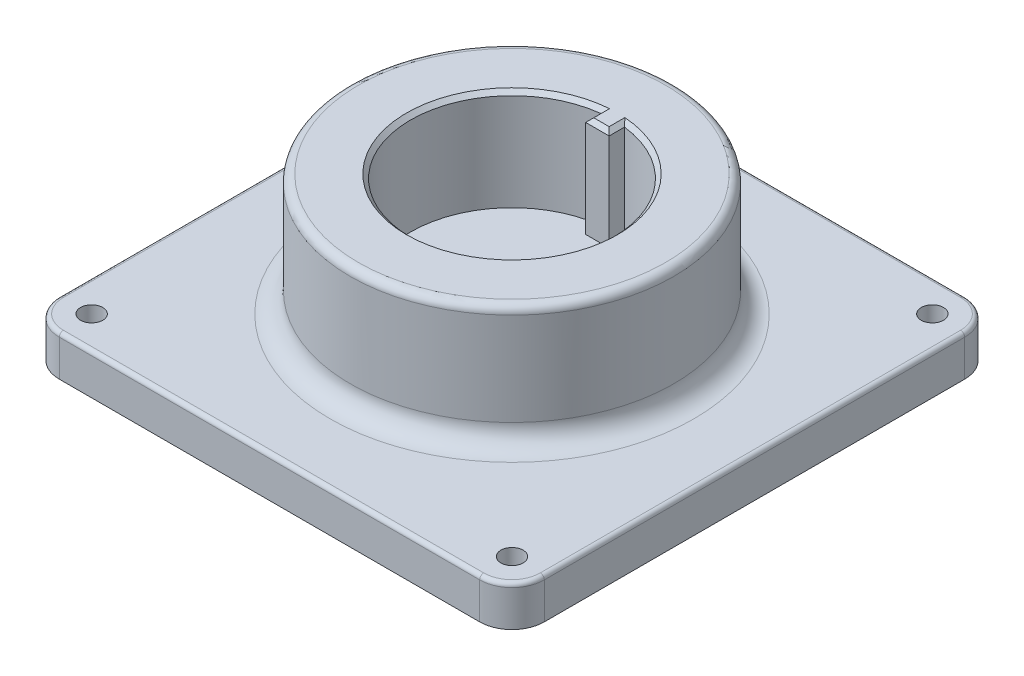
ISO-10303-21;
HEADER;
FILE_DESCRIPTION(('STEP AP214'),'2;1');
FILE_NAME('part.step','',(''),(''),'','','');
FILE_SCHEMA(('AUTOMOTIVE_DESIGN { 1 0 10303 214 1 1 1 1 }'));
ENDSEC;
DATA;
#1=APPLICATION_CONTEXT('core data for automotive mechanical design processes');
#2=APPLICATION_PROTOCOL_DEFINITION('international standard','automotive_design',2000,#1);
#3=PRODUCT_CONTEXT('',#1,'mechanical');
#4=PRODUCT('Part','Part','',(#3));
#5=PRODUCT_RELATED_PRODUCT_CATEGORY('part','',(#4));
#6=PRODUCT_DEFINITION_FORMATION('','',#4);
#7=PRODUCT_DEFINITION_CONTEXT('part definition',#1,'design');
#8=PRODUCT_DEFINITION('design','',#6,#7);
#9=PRODUCT_DEFINITION_SHAPE('','',#8);
#10=(LENGTH_UNIT() NAMED_UNIT(*) SI_UNIT(.MILLI.,.METRE.));
#11=(NAMED_UNIT(*) PLANE_ANGLE_UNIT() SI_UNIT($,.RADIAN.));
#12=(NAMED_UNIT(*) SI_UNIT($,.STERADIAN.) SOLID_ANGLE_UNIT());
#13=UNCERTAINTY_MEASURE_WITH_UNIT(LENGTH_MEASURE(1.E-05),#10,'distance_accuracy_value','');
#14=(GEOMETRIC_REPRESENTATION_CONTEXT(3) GLOBAL_UNCERTAINTY_ASSIGNED_CONTEXT((#13)) GLOBAL_UNIT_ASSIGNED_CONTEXT((#10,
#11,#12)) REPRESENTATION_CONTEXT('',''));
#15=CARTESIAN_POINT('',(0.,0.,0.));
#16=DIRECTION('',(0.,0.,1.));
#17=DIRECTION('',(1.,0.,0.));
#18=AXIS2_PLACEMENT_3D('',#15,#16,#17);
#19=CARTESIAN_POINT('',(60.,10.,60.));
#20=DIRECTION('',(-1.,0.,0.));
#21=DIRECTION('',(0.,0.,1.));
#22=AXIS2_PLACEMENT_3D('',#19,#20,#21);
#23=PLANE('',#22);
#24=DIRECTION('',(0.,-1.,0.));
#25=VECTOR('',#24,1.);
#26=CARTESIAN_POINT('',(60.,10.,-52.));
#27=LINE('',#26,#25);
#28=CARTESIAN_POINT('',(60.,0.,-52.));
#29=VERTEX_POINT('',#28);
#30=CARTESIAN_POINT('',(60.,9.,-52.));
#31=VERTEX_POINT('',#30);
#32=EDGE_CURVE('E286',#29,#31,#27,.F.);
#33=ORIENTED_EDGE('',*,*,#32,.T.);
#34=DIRECTION('',(0.,0.,-1.));
#35=VECTOR('',#34,1.);
#36=CARTESIAN_POINT('',(60.,9.,60.));
#37=LINE('',#36,#35);
#38=CARTESIAN_POINT('',(60.,9.,52.));
#39=VERTEX_POINT('',#38);
#40=EDGE_CURVE('E335',#31,#39,#37,.F.);
#41=ORIENTED_EDGE('',*,*,#40,.T.);
#42=DIRECTION('',(0.,-1.,0.));
#43=VECTOR('',#42,1.);
#44=CARTESIAN_POINT('',(60.,10.,52.));
#45=LINE('',#44,#43);
#46=CARTESIAN_POINT('',(60.,0.,52.));
#47=VERTEX_POINT('',#46);
#48=EDGE_CURVE('E290',#39,#47,#45,.T.);
#49=ORIENTED_EDGE('',*,*,#48,.T.);
#50=DIRECTION('',(0.,0.,-1.));
#51=VECTOR('',#50,1.);
#52=CARTESIAN_POINT('',(60.,0.,60.));
#53=LINE('',#52,#51);
#54=EDGE_CURVE('E241',#47,#29,#53,.T.);
#55=ORIENTED_EDGE('',*,*,#54,.T.);
#56=EDGE_LOOP('',(#33,#41,#49,#55));
#57=FACE_BOUND('',#56,.T.);
#58=ADVANCED_FACE('F41',(#57),#23,.F.);
#59=CARTESIAN_POINT('',(-60.,10.,-60.));
#60=DIRECTION('',(0.,0.,1.));
#61=DIRECTION('',(1.,0.,0.));
#62=AXIS2_PLACEMENT_3D('',#59,#60,#61);
#63=PLANE('',#62);
#64=DIRECTION('',(0.,-1.,0.));
#65=VECTOR('',#64,1.);
#66=CARTESIAN_POINT('',(-52.,10.,-60.));
#67=LINE('',#66,#65);
#68=CARTESIAN_POINT('',(-52.,0.,-60.));
#69=VERTEX_POINT('',#68);
#70=CARTESIAN_POINT('',(-52.,9.,-60.));
#71=VERTEX_POINT('',#70);
#72=EDGE_CURVE('E293',#69,#71,#67,.F.);
#73=ORIENTED_EDGE('',*,*,#72,.T.);
#74=DIRECTION('',(-1.,0.,0.));
#75=VECTOR('',#74,1.);
#76=CARTESIAN_POINT('',(-60.,9.,-60.));
#77=LINE('',#76,#75);
#78=CARTESIAN_POINT('',(52.,9.,-60.));
#79=VERTEX_POINT('',#78);
#80=EDGE_CURVE('E329',#71,#79,#77,.F.);
#81=ORIENTED_EDGE('',*,*,#80,.T.);
#82=DIRECTION('',(0.,-1.,0.));
#83=VECTOR('',#82,1.);
#84=CARTESIAN_POINT('',(52.,10.,-60.));
#85=LINE('',#84,#83);
#86=CARTESIAN_POINT('',(52.,0.,-60.));
#87=VERTEX_POINT('',#86);
#88=EDGE_CURVE('E297',#79,#87,#85,.T.);
#89=ORIENTED_EDGE('',*,*,#88,.T.);
#90=DIRECTION('',(-1.,0.,0.));
#91=VECTOR('',#90,1.);
#92=CARTESIAN_POINT('',(-60.,0.,-60.));
#93=LINE('',#92,#91);
#94=EDGE_CURVE('E248',#87,#69,#93,.T.);
#95=ORIENTED_EDGE('',*,*,#94,.T.);
#96=EDGE_LOOP('',(#73,#81,#89,#95));
#97=FACE_BOUND('',#96,.T.);
#98=ADVANCED_FACE('F459',(#97),#63,.F.);
#99=CARTESIAN_POINT('',(-60.,10.,60.));
#100=DIRECTION('',(1.,0.,0.));
#101=DIRECTION('',(0.,0.,-1.));
#102=AXIS2_PLACEMENT_3D('',#99,#100,#101);
#103=PLANE('',#102);
#104=DIRECTION('',(0.,-1.,0.));
#105=VECTOR('',#104,1.);
#106=CARTESIAN_POINT('',(-60.,10.,52.));
#107=LINE('',#106,#105);
#108=CARTESIAN_POINT('',(-60.,0.,52.));
#109=VERTEX_POINT('',#108);
#110=CARTESIAN_POINT('',(-60.,9.,52.));
#111=VERTEX_POINT('',#110);
#112=EDGE_CURVE('E282',#109,#111,#107,.F.);
#113=ORIENTED_EDGE('',*,*,#112,.T.);
#114=DIRECTION('',(0.,0.,1.));
#115=VECTOR('',#114,1.);
#116=CARTESIAN_POINT('',(-60.,9.,60.));
#117=LINE('',#116,#115);
#118=CARTESIAN_POINT('',(-60.,9.,-52.));
#119=VERTEX_POINT('',#118);
#120=EDGE_CURVE('E347',#111,#119,#117,.F.);
#121=ORIENTED_EDGE('',*,*,#120,.T.);
#122=DIRECTION('',(0.,-1.,0.));
#123=VECTOR('',#122,1.);
#124=CARTESIAN_POINT('',(-60.,10.,-52.));
#125=LINE('',#124,#123);
#126=CARTESIAN_POINT('',(-60.,0.,-52.));
#127=VERTEX_POINT('',#126);
#128=EDGE_CURVE('E279',#119,#127,#125,.T.);
#129=ORIENTED_EDGE('',*,*,#128,.T.);
#130=DIRECTION('',(0.,0.,1.));
#131=VECTOR('',#130,1.);
#132=CARTESIAN_POINT('',(-60.,0.,60.));
#133=LINE('',#132,#131);
#134=EDGE_CURVE('E252',#127,#109,#133,.T.);
#135=ORIENTED_EDGE('',*,*,#134,.T.);
#136=EDGE_LOOP('',(#113,#121,#129,#135));
#137=FACE_BOUND('',#136,.T.);
#138=ADVANCED_FACE('F465',(#137),#103,.F.);
#139=CARTESIAN_POINT('',(-60.,10.,60.));
#140=DIRECTION('',(0.,0.,-1.));
#141=DIRECTION('',(-1.,0.,0.));
#142=AXIS2_PLACEMENT_3D('',#139,#140,#141);
#143=PLANE('',#142);
#144=DIRECTION('',(0.,-1.,0.));
#145=VECTOR('',#144,1.);
#146=CARTESIAN_POINT('',(52.,10.,60.));
#147=LINE('',#146,#145);
#148=CARTESIAN_POINT('',(52.,0.,60.));
#149=VERTEX_POINT('',#148);
#150=CARTESIAN_POINT('',(52.,9.,60.));
#151=VERTEX_POINT('',#150);
#152=EDGE_CURVE('E260',#149,#151,#147,.F.);
#153=ORIENTED_EDGE('',*,*,#152,.T.);
#154=DIRECTION('',(1.,0.,0.));
#155=VECTOR('',#154,1.);
#156=CARTESIAN_POINT('',(-60.,9.,60.));
#157=LINE('',#156,#155);
#158=CARTESIAN_POINT('',(-52.,9.,60.));
#159=VERTEX_POINT('',#158);
#160=EDGE_CURVE('E341',#151,#159,#157,.F.);
#161=ORIENTED_EDGE('',*,*,#160,.T.);
#162=DIRECTION('',(0.,-1.,0.));
#163=VECTOR('',#162,1.);
#164=CARTESIAN_POINT('',(-52.,10.,60.));
#165=LINE('',#164,#163);
#166=CARTESIAN_POINT('',(-52.,0.,60.));
#167=VERTEX_POINT('',#166);
#168=EDGE_CURVE('E264',#159,#167,#165,.T.);
#169=ORIENTED_EDGE('',*,*,#168,.T.);
#170=DIRECTION('',(1.,0.,0.));
#171=VECTOR('',#170,1.);
#172=CARTESIAN_POINT('',(-60.,0.,60.));
#173=LINE('',#172,#171);
#174=EDGE_CURVE('E256',#167,#149,#173,.T.);
#175=ORIENTED_EDGE('',*,*,#174,.T.);
#176=EDGE_LOOP('',(#153,#161,#169,#175));
#177=FACE_BOUND('',#176,.T.);
#178=ADVANCED_FACE('F530',(#177),#143,.F.);
#179=CARTESIAN_POINT('',(0.,10.,0.));
#180=DIRECTION('',(0.,-1.,0.));
#181=DIRECTION('',(0.,0.,-1.));
#182=AXIS2_PLACEMENT_3D('',#179,#180,#181);
#183=PLANE('',#182);
#184=CARTESIAN_POINT('',(0.,10.,0.));
#185=DIRECTION('',(0.,-1.,0.));
#186=DIRECTION('',(0.,0.,-1.));
#187=AXIS2_PLACEMENT_3D('',#184,#185,#186);
#188=CIRCLE('',#187,45.);
#189=CARTESIAN_POINT('',(0.,10.,-45.));
#190=VERTEX_POINT('',#189);
#191=EDGE_CURVE('E11',#190,#190,#188,.T.);
#192=ORIENTED_EDGE('',*,*,#191,.T.);
#193=EDGE_LOOP('',(#192));
#194=FACE_BOUND('',#193,.T.);
#195=DIRECTION('',(-1.,0.,0.));
#196=VECTOR('',#195,1.);
#197=CARTESIAN_POINT('',(0.,10.,-59.));
#198=LINE('',#197,#196);
#199=CARTESIAN_POINT('',(52.,10.,-59.));
#200=VERTEX_POINT('',#199);
#201=CARTESIAN_POINT('',(-52.,10.,-59.));
#202=VERTEX_POINT('',#201);
#203=EDGE_CURVE('E318',#200,#202,#198,.T.);
#204=ORIENTED_EDGE('',*,*,#203,.T.);
#205=CARTESIAN_POINT('',(-52.,10.,-52.));
#206=DIRECTION('',(0.,-1.,0.));
#207=DIRECTION('',(0.,0.,-1.));
#208=AXIS2_PLACEMENT_3D('',#205,#206,#207);
#209=CIRCLE('',#208,7.);
#210=CARTESIAN_POINT('',(-59.,10.,-52.));
#211=VERTEX_POINT('',#210);
#212=EDGE_CURVE('E321',#202,#211,#209,.F.);
#213=ORIENTED_EDGE('',*,*,#212,.T.);
#214=DIRECTION('',(0.,0.,1.));
#215=VECTOR('',#214,1.);
#216=CARTESIAN_POINT('',(-59.,10.,0.));
#217=LINE('',#216,#215);
#218=CARTESIAN_POINT('',(-59.,10.,52.));
#219=VERTEX_POINT('',#218);
#220=EDGE_CURVE('E300',#211,#219,#217,.T.);
#221=ORIENTED_EDGE('',*,*,#220,.T.);
#222=CARTESIAN_POINT('',(-52.,10.,52.));
#223=DIRECTION('',(0.,-1.,0.));
#224=DIRECTION('',(0.,0.,-1.));
#225=AXIS2_PLACEMENT_3D('',#222,#223,#224);
#226=CIRCLE('',#225,7.);
#227=CARTESIAN_POINT('',(-52.,10.,59.));
#228=VERTEX_POINT('',#227);
#229=EDGE_CURVE('E303',#219,#228,#226,.F.);
#230=ORIENTED_EDGE('',*,*,#229,.T.);
#231=DIRECTION('',(1.,0.,0.));
#232=VECTOR('',#231,1.);
#233=CARTESIAN_POINT('',(0.,10.,59.));
#234=LINE('',#233,#232);
#235=CARTESIAN_POINT('',(52.,10.,59.));
#236=VERTEX_POINT('',#235);
#237=EDGE_CURVE('E306',#228,#236,#234,.T.);
#238=ORIENTED_EDGE('',*,*,#237,.T.);
#239=CARTESIAN_POINT('',(52.,10.,52.));
#240=DIRECTION('',(0.,-1.,0.));
#241=DIRECTION('',(0.,0.,-1.));
#242=AXIS2_PLACEMENT_3D('',#239,#240,#241);
#243=CIRCLE('',#242,7.);
#244=CARTESIAN_POINT('',(59.,10.,52.));
#245=VERTEX_POINT('',#244);
#246=EDGE_CURVE('E309',#236,#245,#243,.F.);
#247=ORIENTED_EDGE('',*,*,#246,.T.);
#248=DIRECTION('',(0.,0.,-1.));
#249=VECTOR('',#248,1.);
#250=CARTESIAN_POINT('',(59.,10.,0.));
#251=LINE('',#250,#249);
#252=CARTESIAN_POINT('',(59.,10.,-52.));
#253=VERTEX_POINT('',#252);
#254=EDGE_CURVE('E312',#245,#253,#251,.T.);
#255=ORIENTED_EDGE('',*,*,#254,.T.);
#256=CARTESIAN_POINT('',(52.,10.,-52.));
#257=DIRECTION('',(0.,-1.,0.));
#258=DIRECTION('',(0.,0.,-1.));
#259=AXIS2_PLACEMENT_3D('',#256,#257,#258);
#260=CIRCLE('',#259,7.);
#261=EDGE_CURVE('E315',#253,#200,#260,.F.);
#262=ORIENTED_EDGE('',*,*,#261,.T.);
#263=EDGE_LOOP('',(#204,#213,#221,#230,#238,#247,#255,#262));
#264=FACE_BOUND('',#263,.T.);
#265=CARTESIAN_POINT('',(-51.9999999999998,10.,52.0000000000002));
#266=DIRECTION('',(0.,1.,0.));
#267=DIRECTION('',(1.,0.,0.));
#268=AXIS2_PLACEMENT_3D('',#265,#266,#267);
#269=CIRCLE('',#268,2.75);
#270=CARTESIAN_POINT('',(-49.2499999999998,10.,52.0000000000002));
#271=VERTEX_POINT('',#270);
#272=EDGE_CURVE('E216',#271,#271,#269,.T.);
#273=ORIENTED_EDGE('',*,*,#272,.F.);
#274=EDGE_LOOP('',(#273));
#275=FACE_BOUND('',#274,.T.);
#276=CARTESIAN_POINT('',(52.,10.,52.));
#277=DIRECTION('',(0.,1.,0.));
#278=DIRECTION('',(0.,0.,-1.));
#279=AXIS2_PLACEMENT_3D('',#276,#277,#278);
#280=CIRCLE('',#279,2.75);
#281=CARTESIAN_POINT('',(52.,10.,49.25));
#282=VERTEX_POINT('',#281);
#283=EDGE_CURVE('E224',#282,#282,#280,.T.);
#284=ORIENTED_EDGE('',*,*,#283,.F.);
#285=EDGE_LOOP('',(#284));
#286=FACE_BOUND('',#285,.T.);
#287=CARTESIAN_POINT('',(51.9999999999995,10.,-52.0000000000005));
#288=DIRECTION('',(0.,1.,0.));
#289=DIRECTION('',(-1.,0.,0.));
#290=AXIS2_PLACEMENT_3D('',#287,#288,#289);
#291=CIRCLE('',#290,2.75);
#292=CARTESIAN_POINT('',(49.2499999999994,10.,-52.0000000000005));
#293=VERTEX_POINT('',#292);
#294=EDGE_CURVE('E232',#293,#293,#291,.T.);
#295=ORIENTED_EDGE('',*,*,#294,.F.);
#296=EDGE_LOOP('',(#295));
#297=FACE_BOUND('',#296,.T.);
#298=CARTESIAN_POINT('',(-52.,10.,-52.));
#299=DIRECTION('',(0.,1.,0.));
#300=DIRECTION('',(0.,0.,1.));
#301=AXIS2_PLACEMENT_3D('',#298,#299,#300);
#302=CIRCLE('',#301,2.75);
#303=CARTESIAN_POINT('',(-52.,10.,-49.25));
#304=VERTEX_POINT('',#303);
#305=EDGE_CURVE('E215',#304,#304,#302,.T.);
#306=ORIENTED_EDGE('',*,*,#305,.F.);
#307=EDGE_LOOP('',(#306));
#308=FACE_BOUND('',#307,.T.);
#309=ADVANCED_FACE('F550',(#194,#264,#275,#286,#297,#308),#183,.F.);
#310=CARTESIAN_POINT('',(0.,0.,0.));
#311=DIRECTION('',(0.,-1.,0.));
#312=DIRECTION('',(0.,0.,-1.));
#313=AXIS2_PLACEMENT_3D('',#310,#311,#312);
#314=PLANE('',#313);
#315=CARTESIAN_POINT('',(-51.9999999999998,0.,52.0000000000002));
#316=DIRECTION('',(0.,1.,0.));
#317=DIRECTION('',(1.,0.,0.));
#318=AXIS2_PLACEMENT_3D('',#315,#316,#317);
#319=CIRCLE('',#318,2.75);
#320=CARTESIAN_POINT('',(-49.2499999999998,0.,52.0000000000002));
#321=VERTEX_POINT('',#320);
#322=EDGE_CURVE('E211',#321,#321,#319,.T.);
#323=ORIENTED_EDGE('',*,*,#322,.T.);
#324=EDGE_LOOP('',(#323));
#325=FACE_BOUND('',#324,.T.);
#326=CARTESIAN_POINT('',(52.,0.,52.));
#327=DIRECTION('',(0.,1.,0.));
#328=DIRECTION('',(0.,0.,-1.));
#329=AXIS2_PLACEMENT_3D('',#326,#327,#328);
#330=CIRCLE('',#329,2.75);
#331=CARTESIAN_POINT('',(52.,0.,49.25));
#332=VERTEX_POINT('',#331);
#333=EDGE_CURVE('E220',#332,#332,#330,.T.);
#334=ORIENTED_EDGE('',*,*,#333,.T.);
#335=EDGE_LOOP('',(#334));
#336=FACE_BOUND('',#335,.T.);
#337=CARTESIAN_POINT('',(51.9999999999995,0.,-52.0000000000005));
#338=DIRECTION('',(0.,1.,0.));
#339=DIRECTION('',(-1.,0.,0.));
#340=AXIS2_PLACEMENT_3D('',#337,#338,#339);
#341=CIRCLE('',#340,2.75);
#342=CARTESIAN_POINT('',(49.2499999999994,0.,-52.0000000000005));
#343=VERTEX_POINT('',#342);
#344=EDGE_CURVE('E228',#343,#343,#341,.T.);
#345=ORIENTED_EDGE('',*,*,#344,.T.);
#346=EDGE_LOOP('',(#345));
#347=FACE_BOUND('',#346,.T.);
#348=CARTESIAN_POINT('',(-52.,0.,-52.));
#349=DIRECTION('',(0.,1.,0.));
#350=DIRECTION('',(0.,0.,1.));
#351=AXIS2_PLACEMENT_3D('',#348,#349,#350);
#352=CIRCLE('',#351,2.75);
#353=CARTESIAN_POINT('',(-52.,0.,-49.25));
#354=VERTEX_POINT('',#353);
#355=EDGE_CURVE('E237',#354,#354,#352,.T.);
#356=ORIENTED_EDGE('',*,*,#355,.T.);
#357=EDGE_LOOP('',(#356));
#358=FACE_BOUND('',#357,.T.);
#359=ORIENTED_EDGE('',*,*,#174,.F.);
#360=CARTESIAN_POINT('',(-52.,0.,52.));
#361=DIRECTION('',(0.,-1.,0.));
#362=DIRECTION('',(0.,0.,-1.));
#363=AXIS2_PLACEMENT_3D('',#360,#361,#362);
#364=CIRCLE('',#363,8.);
#365=EDGE_CURVE('E276',#167,#109,#364,.T.);
#366=ORIENTED_EDGE('',*,*,#365,.T.);
#367=ORIENTED_EDGE('',*,*,#134,.F.);
#368=CARTESIAN_POINT('',(-52.,0.,-52.));
#369=DIRECTION('',(0.,-1.,0.));
#370=DIRECTION('',(0.,0.,-1.));
#371=AXIS2_PLACEMENT_3D('',#368,#369,#370);
#372=CIRCLE('',#371,8.);
#373=EDGE_CURVE('E267',#127,#69,#372,.T.);
#374=ORIENTED_EDGE('',*,*,#373,.T.);
#375=ORIENTED_EDGE('',*,*,#94,.F.);
#376=CARTESIAN_POINT('',(52.,0.,-52.));
#377=DIRECTION('',(0.,-1.,0.));
#378=DIRECTION('',(0.,0.,-1.));
#379=AXIS2_PLACEMENT_3D('',#376,#377,#378);
#380=CIRCLE('',#379,8.);
#381=EDGE_CURVE('E270',#87,#29,#380,.T.);
#382=ORIENTED_EDGE('',*,*,#381,.T.);
#383=ORIENTED_EDGE('',*,*,#54,.F.);
#384=CARTESIAN_POINT('',(52.,0.,52.));
#385=DIRECTION('',(0.,-1.,0.));
#386=DIRECTION('',(0.,0.,-1.));
#387=AXIS2_PLACEMENT_3D('',#384,#385,#386);
#388=CIRCLE('',#387,8.);
#389=EDGE_CURVE('E273',#47,#149,#388,.T.);
#390=ORIENTED_EDGE('',*,*,#389,.T.);
#391=EDGE_LOOP('',(#359,#366,#367,#374,#375,#382,#383,#390));
#392=FACE_BOUND('',#391,.T.);
#393=ADVANCED_FACE('F537',(#325,#336,#347,#358,#392),#314,.T.);
#394=CARTESIAN_POINT('',(-52.,0.,-52.));
#395=DIRECTION('',(0.,1.,0.));
#396=DIRECTION('',(0.,0.,1.));
#397=AXIS2_PLACEMENT_3D('',#394,#395,#396);
#398=CYLINDRICAL_SURFACE('',#397,2.75);
#399=ORIENTED_EDGE('',*,*,#355,.F.);
#400=EDGE_LOOP('',(#399));
#401=FACE_BOUND('',#400,.T.);
#402=ORIENTED_EDGE('',*,*,#305,.T.);
#403=EDGE_LOOP('',(#402));
#404=FACE_BOUND('',#403,.T.);
#405=ADVANCED_FACE('F576',(#401,#404),#398,.F.);
#406=CARTESIAN_POINT('',(51.9999999999995,0.,-52.0000000000005));
#407=DIRECTION('',(0.,1.,0.));
#408=DIRECTION('',(0.,0.,1.));
#409=AXIS2_PLACEMENT_3D('',#406,#407,#408);
#410=CYLINDRICAL_SURFACE('',#409,2.75);
#411=ORIENTED_EDGE('',*,*,#344,.F.);
#412=EDGE_LOOP('',(#411));
#413=FACE_BOUND('',#412,.T.);
#414=ORIENTED_EDGE('',*,*,#294,.T.);
#415=EDGE_LOOP('',(#414));
#416=FACE_BOUND('',#415,.T.);
#417=ADVANCED_FACE('F583',(#413,#416),#410,.F.);
#418=CARTESIAN_POINT('',(52.,0.,52.));
#419=DIRECTION('',(0.,1.,0.));
#420=DIRECTION('',(0.,0.,1.));
#421=AXIS2_PLACEMENT_3D('',#418,#419,#420);
#422=CYLINDRICAL_SURFACE('',#421,2.75);
#423=ORIENTED_EDGE('',*,*,#333,.F.);
#424=EDGE_LOOP('',(#423));
#425=FACE_BOUND('',#424,.T.);
#426=ORIENTED_EDGE('',*,*,#283,.T.);
#427=EDGE_LOOP('',(#426));
#428=FACE_BOUND('',#427,.T.);
#429=ADVANCED_FACE('F587',(#425,#428),#422,.F.);
#430=CARTESIAN_POINT('',(-51.9999999999998,0.,52.0000000000002));
#431=DIRECTION('',(0.,1.,0.));
#432=DIRECTION('',(0.,0.,1.));
#433=AXIS2_PLACEMENT_3D('',#430,#431,#432);
#434=CYLINDRICAL_SURFACE('',#433,2.75);
#435=ORIENTED_EDGE('',*,*,#322,.F.);
#436=EDGE_LOOP('',(#435));
#437=FACE_BOUND('',#436,.T.);
#438=ORIENTED_EDGE('',*,*,#272,.T.);
#439=EDGE_LOOP('',(#438));
#440=FACE_BOUND('',#439,.T.);
#441=ADVANCED_FACE('F474',(#437,#440),#434,.F.);
#442=CARTESIAN_POINT('',(-52.,10.,52.));
#443=DIRECTION('',(0.,-1.,0.));
#444=DIRECTION('',(0.,0.,-1.));
#445=AXIS2_PLACEMENT_3D('',#442,#443,#444);
#446=CYLINDRICAL_SURFACE('',#445,8.);
#447=ORIENTED_EDGE('',*,*,#168,.F.);
#448=CARTESIAN_POINT('',(-52.,9.,52.));
#449=DIRECTION('',(0.,-1.,0.));
#450=DIRECTION('',(0.,0.,-1.));
#451=AXIS2_PLACEMENT_3D('',#448,#449,#450);
#452=CIRCLE('',#451,8.);
#453=EDGE_CURVE('E344',#159,#111,#452,.T.);
#454=ORIENTED_EDGE('',*,*,#453,.T.);
#455=ORIENTED_EDGE('',*,*,#112,.F.);
#456=ORIENTED_EDGE('',*,*,#365,.F.);
#457=EDGE_LOOP('',(#447,#454,#455,#456));
#458=FACE_BOUND('',#457,.T.);
#459=ADVANCED_FACE('F470',(#458),#446,.T.);
#460=CARTESIAN_POINT('',(52.,10.,52.));
#461=DIRECTION('',(0.,-1.,0.));
#462=DIRECTION('',(0.,0.,-1.));
#463=AXIS2_PLACEMENT_3D('',#460,#461,#462);
#464=CYLINDRICAL_SURFACE('',#463,8.);
#465=ORIENTED_EDGE('',*,*,#48,.F.);
#466=CARTESIAN_POINT('',(52.,9.,52.));
#467=DIRECTION('',(0.,-1.,0.));
#468=DIRECTION('',(0.,0.,-1.));
#469=AXIS2_PLACEMENT_3D('',#466,#467,#468);
#470=CIRCLE('',#469,8.);
#471=EDGE_CURVE('E338',#39,#151,#470,.T.);
#472=ORIENTED_EDGE('',*,*,#471,.T.);
#473=ORIENTED_EDGE('',*,*,#152,.F.);
#474=ORIENTED_EDGE('',*,*,#389,.F.);
#475=EDGE_LOOP('',(#465,#472,#473,#474));
#476=FACE_BOUND('',#475,.T.);
#477=ADVANCED_FACE('F473',(#476),#464,.T.);
#478=CARTESIAN_POINT('',(52.,10.,-52.));
#479=DIRECTION('',(0.,-1.,0.));
#480=DIRECTION('',(0.,0.,-1.));
#481=AXIS2_PLACEMENT_3D('',#478,#479,#480);
#482=CYLINDRICAL_SURFACE('',#481,8.);
#483=ORIENTED_EDGE('',*,*,#88,.F.);
#484=CARTESIAN_POINT('',(52.,9.,-52.));
#485=DIRECTION('',(0.,-1.,0.));
#486=DIRECTION('',(0.,0.,-1.));
#487=AXIS2_PLACEMENT_3D('',#484,#485,#486);
#488=CIRCLE('',#487,8.);
#489=EDGE_CURVE('E332',#79,#31,#488,.T.);
#490=ORIENTED_EDGE('',*,*,#489,.T.);
#491=ORIENTED_EDGE('',*,*,#32,.F.);
#492=ORIENTED_EDGE('',*,*,#381,.F.);
#493=EDGE_LOOP('',(#483,#490,#491,#492));
#494=FACE_BOUND('',#493,.T.);
#495=ADVANCED_FACE('F478',(#494),#482,.T.);
#496=CARTESIAN_POINT('',(-52.,10.,-52.));
#497=DIRECTION('',(0.,-1.,0.));
#498=DIRECTION('',(0.,0.,-1.));
#499=AXIS2_PLACEMENT_3D('',#496,#497,#498);
#500=CYLINDRICAL_SURFACE('',#499,8.);
#501=ORIENTED_EDGE('',*,*,#128,.F.);
#502=CARTESIAN_POINT('',(-52.,9.,-52.));
#503=DIRECTION('',(0.,-1.,0.));
#504=DIRECTION('',(0.,0.,-1.));
#505=AXIS2_PLACEMENT_3D('',#502,#503,#504);
#506=CIRCLE('',#505,8.);
#507=EDGE_CURVE('E325',#119,#71,#506,.T.);
#508=ORIENTED_EDGE('',*,*,#507,.T.);
#509=ORIENTED_EDGE('',*,*,#72,.F.);
#510=ORIENTED_EDGE('',*,*,#373,.F.);
#511=EDGE_LOOP('',(#501,#508,#509,#510));
#512=FACE_BOUND('',#511,.T.);
#513=ADVANCED_FACE('F482',(#512),#500,.T.);
#514=CARTESIAN_POINT('',(52.,9.,52.));
#515=DIRECTION('',(0.,-1.,0.));
#516=DIRECTION('',(0.,0.,-1.));
#517=AXIS2_PLACEMENT_3D('',#514,#515,#516);
#518=TOROIDAL_SURFACE('',#517,7.,1.);
#519=CARTESIAN_POINT('',(52.,9.,59.));
#520=DIRECTION('',(-1.,0.,0.));
#521=DIRECTION('',(0.,0.,1.));
#522=AXIS2_PLACEMENT_3D('',#519,#520,#521);
#523=CIRCLE('',#522,1.);
#524=EDGE_CURVE('E372',#151,#236,#523,.T.);
#525=ORIENTED_EDGE('',*,*,#524,.F.);
#526=ORIENTED_EDGE('',*,*,#471,.F.);
#527=CARTESIAN_POINT('',(59.,9.,52.));
#528=DIRECTION('',(0.,0.,-1.));
#529=DIRECTION('',(-1.,0.,0.));
#530=AXIS2_PLACEMENT_3D('',#527,#528,#529);
#531=CIRCLE('',#530,1.);
#532=EDGE_CURVE('E236',#245,#39,#531,.T.);
#533=ORIENTED_EDGE('',*,*,#532,.F.);
#534=ORIENTED_EDGE('',*,*,#246,.F.);
#535=EDGE_LOOP('',(#525,#526,#533,#534));
#536=FACE_BOUND('',#535,.T.);
#537=ADVANCED_FACE('F486',(#536),#518,.T.);
#538=CARTESIAN_POINT('',(59.,9.,0.));
#539=DIRECTION('',(0.,0.,-1.));
#540=DIRECTION('',(-1.,0.,0.));
#541=AXIS2_PLACEMENT_3D('',#538,#539,#540);
#542=CYLINDRICAL_SURFACE('',#541,1.);
#543=ORIENTED_EDGE('',*,*,#532,.T.);
#544=ORIENTED_EDGE('',*,*,#40,.F.);
#545=CARTESIAN_POINT('',(59.,9.,-52.));
#546=DIRECTION('',(0.,0.,-1.));
#547=DIRECTION('',(-1.,0.,0.));
#548=AXIS2_PLACEMENT_3D('',#545,#546,#547);
#549=CIRCLE('',#548,1.);
#550=EDGE_CURVE('E368',#253,#31,#549,.T.);
#551=ORIENTED_EDGE('',*,*,#550,.F.);
#552=ORIENTED_EDGE('',*,*,#254,.F.);
#553=EDGE_LOOP('',(#543,#544,#551,#552));
#554=FACE_BOUND('',#553,.T.);
#555=ADVANCED_FACE('F512',(#554),#542,.T.);
#556=CARTESIAN_POINT('',(0.,9.,59.));
#557=DIRECTION('',(1.,0.,0.));
#558=DIRECTION('',(0.,0.,-1.));
#559=AXIS2_PLACEMENT_3D('',#556,#557,#558);
#560=CYLINDRICAL_SURFACE('',#559,1.);
#561=ORIENTED_EDGE('',*,*,#524,.T.);
#562=ORIENTED_EDGE('',*,*,#237,.F.);
#563=CARTESIAN_POINT('',(-52.,9.,59.));
#564=DIRECTION('',(-1.,0.,0.));
#565=DIRECTION('',(0.,0.,1.));
#566=AXIS2_PLACEMENT_3D('',#563,#564,#565);
#567=CIRCLE('',#566,1.);
#568=EDGE_CURVE('E364',#159,#228,#567,.T.);
#569=ORIENTED_EDGE('',*,*,#568,.F.);
#570=ORIENTED_EDGE('',*,*,#160,.F.);
#571=EDGE_LOOP('',(#561,#562,#569,#570));
#572=FACE_BOUND('',#571,.T.);
#573=ADVANCED_FACE('F508',(#572),#560,.T.);
#574=CARTESIAN_POINT('',(52.,9.,-52.));
#575=DIRECTION('',(0.,-1.,0.));
#576=DIRECTION('',(0.,0.,-1.));
#577=AXIS2_PLACEMENT_3D('',#574,#575,#576);
#578=TOROIDAL_SURFACE('',#577,7.,1.);
#579=ORIENTED_EDGE('',*,*,#550,.T.);
#580=ORIENTED_EDGE('',*,*,#489,.F.);
#581=CARTESIAN_POINT('',(52.,9.,-59.));
#582=DIRECTION('',(-1.,0.,0.));
#583=DIRECTION('',(0.,0.,1.));
#584=AXIS2_PLACEMENT_3D('',#581,#582,#583);
#585=CIRCLE('',#584,1.);
#586=EDGE_CURVE('E360',#200,#79,#585,.T.);
#587=ORIENTED_EDGE('',*,*,#586,.F.);
#588=ORIENTED_EDGE('',*,*,#261,.F.);
#589=EDGE_LOOP('',(#579,#580,#587,#588));
#590=FACE_BOUND('',#589,.T.);
#591=ADVANCED_FACE('F504',(#590),#578,.T.);
#592=CARTESIAN_POINT('',(-52.,9.,52.));
#593=DIRECTION('',(0.,-1.,0.));
#594=DIRECTION('',(0.,0.,-1.));
#595=AXIS2_PLACEMENT_3D('',#592,#593,#594);
#596=TOROIDAL_SURFACE('',#595,7.,1.);
#597=ORIENTED_EDGE('',*,*,#568,.T.);
#598=ORIENTED_EDGE('',*,*,#229,.F.);
#599=CARTESIAN_POINT('',(-59.,9.,52.));
#600=DIRECTION('',(0.,0.,-1.));
#601=DIRECTION('',(-1.,0.,0.));
#602=AXIS2_PLACEMENT_3D('',#599,#600,#601);
#603=CIRCLE('',#602,1.);
#604=EDGE_CURVE('E356',#111,#219,#603,.T.);
#605=ORIENTED_EDGE('',*,*,#604,.F.);
#606=ORIENTED_EDGE('',*,*,#453,.F.);
#607=EDGE_LOOP('',(#597,#598,#605,#606));
#608=FACE_BOUND('',#607,.T.);
#609=ADVANCED_FACE('F500',(#608),#596,.T.);
#610=CARTESIAN_POINT('',(0.,9.,-59.));
#611=DIRECTION('',(-1.,0.,0.));
#612=DIRECTION('',(0.,0.,1.));
#613=AXIS2_PLACEMENT_3D('',#610,#611,#612);
#614=CYLINDRICAL_SURFACE('',#613,1.);
#615=ORIENTED_EDGE('',*,*,#586,.T.);
#616=ORIENTED_EDGE('',*,*,#80,.F.);
#617=CARTESIAN_POINT('',(-52.,9.,-59.));
#618=DIRECTION('',(-1.,0.,0.));
#619=DIRECTION('',(0.,0.,1.));
#620=AXIS2_PLACEMENT_3D('',#617,#618,#619);
#621=CIRCLE('',#620,1.);
#622=EDGE_CURVE('E353',#202,#71,#621,.T.);
#623=ORIENTED_EDGE('',*,*,#622,.F.);
#624=ORIENTED_EDGE('',*,*,#203,.F.);
#625=EDGE_LOOP('',(#615,#616,#623,#624));
#626=FACE_BOUND('',#625,.T.);
#627=ADVANCED_FACE('F496',(#626),#614,.T.);
#628=CARTESIAN_POINT('',(-59.,9.,0.));
#629=DIRECTION('',(0.,0.,1.));
#630=DIRECTION('',(1.,0.,0.));
#631=AXIS2_PLACEMENT_3D('',#628,#629,#630);
#632=CYLINDRICAL_SURFACE('',#631,1.);
#633=ORIENTED_EDGE('',*,*,#604,.T.);
#634=ORIENTED_EDGE('',*,*,#220,.F.);
#635=CARTESIAN_POINT('',(-59.,9.,-52.));
#636=DIRECTION('',(0.,0.,-1.));
#637=DIRECTION('',(-1.,0.,0.));
#638=AXIS2_PLACEMENT_3D('',#635,#636,#637);
#639=CIRCLE('',#638,1.);
#640=EDGE_CURVE('E210',#119,#211,#639,.T.);
#641=ORIENTED_EDGE('',*,*,#640,.F.);
#642=ORIENTED_EDGE('',*,*,#120,.F.);
#643=EDGE_LOOP('',(#633,#634,#641,#642));
#644=FACE_BOUND('',#643,.T.);
#645=ADVANCED_FACE('F492',(#644),#632,.T.);
#646=CARTESIAN_POINT('',(-52.,9.,-52.));
#647=DIRECTION('',(0.,-1.,0.));
#648=DIRECTION('',(0.,0.,-1.));
#649=AXIS2_PLACEMENT_3D('',#646,#647,#648);
#650=TOROIDAL_SURFACE('',#649,7.,1.);
#651=ORIENTED_EDGE('',*,*,#622,.T.);
#652=ORIENTED_EDGE('',*,*,#507,.F.);
#653=ORIENTED_EDGE('',*,*,#640,.T.);
#654=ORIENTED_EDGE('',*,*,#212,.F.);
#655=EDGE_LOOP('',(#651,#652,#653,#654));
#656=FACE_BOUND('',#655,.T.);
#657=ADVANCED_FACE('F488',(#656),#650,.T.);
#658=CARTESIAN_POINT('',(0.,40.,0.));
#659=DIRECTION('',(0.,-1.,0.));
#660=DIRECTION('',(0.,0.,-1.));
#661=AXIS2_PLACEMENT_3D('',#658,#659,#660);
#662=CYLINDRICAL_SURFACE('',#661,40.);
#663=CARTESIAN_POINT('',(0.,15.,0.));
#664=DIRECTION('',(0.,-1.,0.));
#665=DIRECTION('',(0.,0.,-1.));
#666=AXIS2_PLACEMENT_3D('',#663,#664,#665);
#667=CIRCLE('',#666,40.);
#668=CARTESIAN_POINT('',(0.,15.,-40.));
#669=VERTEX_POINT('',#668);
#670=EDGE_CURVE('E50',#669,#669,#667,.F.);
#671=ORIENTED_EDGE('',*,*,#670,.T.);
#672=EDGE_LOOP('',(#671));
#673=FACE_BOUND('',#672,.T.);
#674=CARTESIAN_POINT('',(0.,38.,0.));
#675=DIRECTION('',(0.,1.,0.));
#676=DIRECTION('',(0.,0.,1.));
#677=AXIS2_PLACEMENT_3D('',#674,#675,#676);
#678=CIRCLE('',#677,40.);
#679=CARTESIAN_POINT('',(0.,38.,40.));
#680=VERTEX_POINT('',#679);
#681=EDGE_CURVE('E833',#680,#680,#678,.F.);
#682=ORIENTED_EDGE('',*,*,#681,.T.);
#683=EDGE_LOOP('',(#682));
#684=FACE_BOUND('',#683,.T.);
#685=ADVANCED_FACE('F491',(#673,#684),#662,.T.);
#686=CARTESIAN_POINT('',(0.,40.,0.));
#687=DIRECTION('',(0.,1.,0.));
#688=DIRECTION('',(0.,0.,1.));
#689=AXIS2_PLACEMENT_3D('',#686,#687,#688);
#690=PLANE('',#689);
#691=CARTESIAN_POINT('',(0.,40.,0.));
#692=DIRECTION('',(0.,1.,0.));
#693=DIRECTION('',(0.,0.,1.));
#694=AXIS2_PLACEMENT_3D('',#691,#692,#693);
#695=CIRCLE('',#694,38.);
#696=CARTESIAN_POINT('',(0.,40.,38.));
#697=VERTEX_POINT('',#696);
#698=EDGE_CURVE('E400',#697,#697,#695,.T.);
#699=ORIENTED_EDGE('',*,*,#698,.T.);
#700=EDGE_LOOP('',(#699));
#701=FACE_BOUND('',#700,.T.);
#702=CARTESIAN_POINT('',(0.,40.,0.));
#703=DIRECTION('',(0.,1.,0.));
#704=DIRECTION('',(0.,0.,1.));
#705=AXIS2_PLACEMENT_3D('',#702,#703,#704);
#706=CIRCLE('',#705,26.1);
#707=CARTESIAN_POINT('',(1.89999999999996,40.,-26.0307510456384));
#708=VERTEX_POINT('',#707);
#709=CARTESIAN_POINT('',(-1.89999999999996,40.,-26.0307510456384));
#710=VERTEX_POINT('',#709);
#711=EDGE_CURVE('E350',#708,#710,#706,.F.);
#712=ORIENTED_EDGE('',*,*,#711,.T.);
#713=DIRECTION('',(0.,0.,1.));
#714=VECTOR('',#713,1.);
#715=CARTESIAN_POINT('',(-1.89999999999996,40.,0.));
#716=LINE('',#715,#714);
#717=CARTESIAN_POINT('',(-1.89999999999996,40.,-22.1319072675959));
#718=VERTEX_POINT('',#717);
#719=EDGE_CURVE('E387',#710,#718,#716,.T.);
#720=ORIENTED_EDGE('',*,*,#719,.T.);
#721=DIRECTION('',(1.,0.,0.));
#722=VECTOR('',#721,1.);
#723=CARTESIAN_POINT('',(0.,40.,-22.1319072675959));
#724=LINE('',#723,#722);
#725=CARTESIAN_POINT('',(1.89999999999996,40.,-22.1319072675959));
#726=VERTEX_POINT('',#725);
#727=EDGE_CURVE('E384',#718,#726,#724,.T.);
#728=ORIENTED_EDGE('',*,*,#727,.T.);
#729=DIRECTION('',(0.,0.,-1.));
#730=VECTOR('',#729,1.);
#731=CARTESIAN_POINT('',(1.89999999999996,40.,0.));
#732=LINE('',#731,#730);
#733=EDGE_CURVE('E381',#726,#708,#732,.T.);
#734=ORIENTED_EDGE('',*,*,#733,.T.);
#735=EDGE_LOOP('',(#712,#720,#728,#734));
#736=FACE_BOUND('',#735,.T.);
#737=ADVANCED_FACE('F597',(#701,#736),#690,.T.);
#738=CARTESIAN_POINT('',(0.,15.,0.));
#739=DIRECTION('',(0.,1.,0.));
#740=DIRECTION('',(0.,0.,1.));
#741=AXIS2_PLACEMENT_3D('',#738,#739,#740);
#742=CYLINDRICAL_SURFACE('',#741,25.1);
#743=DIRECTION('',(0.,1.,0.));
#744=VECTOR('',#743,1.);
#745=CARTESIAN_POINT('',(-2.9,-0.002000000000002,-24.9319072675959));
#746=LINE('',#745,#744);
#747=CARTESIAN_POINT('',(-2.9,15.,-24.9319072675959));
#748=VERTEX_POINT('',#747);
#749=CARTESIAN_POINT('',(-2.9,39.,-24.9319072675959));
#750=VERTEX_POINT('',#749);
#751=EDGE_CURVE('E187',#748,#750,#746,.T.);
#752=ORIENTED_EDGE('',*,*,#751,.T.);
#753=CARTESIAN_POINT('',(0.,39.,0.));
#754=DIRECTION('',(0.,1.,0.));
#755=DIRECTION('',(0.,0.,1.));
#756=AXIS2_PLACEMENT_3D('',#753,#754,#755);
#757=CIRCLE('',#756,25.1);
#758=CARTESIAN_POINT('',(2.9,39.,-24.9319072675959));
#759=VERTEX_POINT('',#758);
#760=EDGE_CURVE('E57',#750,#759,#757,.T.);
#761=ORIENTED_EDGE('',*,*,#760,.T.);
#762=DIRECTION('',(0.,1.,0.));
#763=VECTOR('',#762,1.);
#764=CARTESIAN_POINT('',(2.9,-0.002000000000002,-24.9319072675959));
#765=LINE('',#764,#763);
#766=CARTESIAN_POINT('',(2.9,15.,-24.9319072675959));
#767=VERTEX_POINT('',#766);
#768=EDGE_CURVE('E198',#767,#759,#765,.T.);
#769=ORIENTED_EDGE('',*,*,#768,.F.);
#770=CARTESIAN_POINT('',(0.,15.,0.));
#771=DIRECTION('',(0.,1.,0.));
#772=DIRECTION('',(0.,0.,1.));
#773=AXIS2_PLACEMENT_3D('',#770,#771,#772);
#774=CIRCLE('',#773,25.1);
#775=EDGE_CURVE('E203',#748,#767,#774,.T.);
#776=ORIENTED_EDGE('',*,*,#775,.F.);
#777=EDGE_LOOP('',(#752,#761,#769,#776));
#778=FACE_BOUND('',#777,.T.);
#779=ADVANCED_FACE('F601',(#778),#742,.F.);
#780=CARTESIAN_POINT('',(0.,15.,0.));
#781=DIRECTION('',(0.,1.,0.));
#782=DIRECTION('',(0.,0.,1.));
#783=AXIS2_PLACEMENT_3D('',#780,#781,#782);
#784=PLANE('',#783);
#785=DIRECTION('',(0.,0.,1.));
#786=VECTOR('',#785,1.);
#787=CARTESIAN_POINT('',(2.9,15.,-21.1319072675959));
#788=LINE('',#787,#786);
#789=CARTESIAN_POINT('',(2.9,15.,-21.1319072675959));
#790=VERTEX_POINT('',#789);
#791=EDGE_CURVE('E175',#767,#790,#788,.T.);
#792=ORIENTED_EDGE('',*,*,#791,.T.);
#793=DIRECTION('',(-1.,0.,0.));
#794=VECTOR('',#793,1.);
#795=CARTESIAN_POINT('',(2.9,15.,-21.1319072675959));
#796=LINE('',#795,#794);
#797=CARTESIAN_POINT('',(-2.9,15.,-21.1319072675959));
#798=VERTEX_POINT('',#797);
#799=EDGE_CURVE('E168',#790,#798,#796,.T.);
#800=ORIENTED_EDGE('',*,*,#799,.T.);
#801=DIRECTION('',(0.,0.,-1.));
#802=VECTOR('',#801,1.);
#803=CARTESIAN_POINT('',(-2.9,15.,-21.1319072675959));
#804=LINE('',#803,#802);
#805=EDGE_CURVE('E172',#798,#748,#804,.T.);
#806=ORIENTED_EDGE('',*,*,#805,.T.);
#807=ORIENTED_EDGE('',*,*,#775,.T.);
#808=EDGE_LOOP('',(#792,#800,#806,#807));
#809=FACE_BOUND('',#808,.T.);
#810=ADVANCED_FACE('F170',(#809),#784,.T.);
#811=CARTESIAN_POINT('',(2.9,-0.002000000000002,-21.1319072675959));
#812=DIRECTION('',(1.,0.,0.));
#813=DIRECTION('',(0.,0.,-1.));
#814=AXIS2_PLACEMENT_3D('',#811,#812,#813);
#815=PLANE('',#814);
#816=ORIENTED_EDGE('',*,*,#768,.T.);
#817=DIRECTION('',(0.,0.,1.));
#818=VECTOR('',#817,1.);
#819=CARTESIAN_POINT('',(2.9,39.,-21.1319072675959));
#820=LINE('',#819,#818);
#821=CARTESIAN_POINT('',(2.9,39.,-21.1319072675959));
#822=VERTEX_POINT('',#821);
#823=EDGE_CURVE('E64',#759,#822,#820,.T.);
#824=ORIENTED_EDGE('',*,*,#823,.T.);
#825=DIRECTION('',(0.,1.,0.));
#826=VECTOR('',#825,1.);
#827=CARTESIAN_POINT('',(2.9,-0.002000000000002,-21.1319072675959));
#828=LINE('',#827,#826);
#829=EDGE_CURVE('E194',#790,#822,#828,.T.);
#830=ORIENTED_EDGE('',*,*,#829,.F.);
#831=ORIENTED_EDGE('',*,*,#791,.F.);
#832=EDGE_LOOP('',(#816,#824,#830,#831));
#833=FACE_BOUND('',#832,.T.);
#834=ADVANCED_FACE('F446',(#833),#815,.T.);
#835=CARTESIAN_POINT('',(2.9,-0.002000000000002,-21.1319072675959));
#836=DIRECTION('',(0.,0.,1.));
#837=DIRECTION('',(1.,0.,0.));
#838=AXIS2_PLACEMENT_3D('',#835,#836,#837);
#839=PLANE('',#838);
#840=ORIENTED_EDGE('',*,*,#829,.T.);
#841=DIRECTION('',(-1.,0.,0.));
#842=VECTOR('',#841,1.);
#843=CARTESIAN_POINT('',(2.9,39.,-21.1319072675959));
#844=LINE('',#843,#842);
#845=CARTESIAN_POINT('',(-2.9,39.,-21.1319072675959));
#846=VERTEX_POINT('',#845);
#847=EDGE_CURVE('E192',#822,#846,#844,.T.);
#848=ORIENTED_EDGE('',*,*,#847,.T.);
#849=DIRECTION('',(0.,1.,0.));
#850=VECTOR('',#849,1.);
#851=CARTESIAN_POINT('',(-2.9,-0.002000000000002,-21.1319072675959));
#852=LINE('',#851,#850);
#853=EDGE_CURVE('E185',#798,#846,#852,.T.);
#854=ORIENTED_EDGE('',*,*,#853,.F.);
#855=ORIENTED_EDGE('',*,*,#799,.F.);
#856=EDGE_LOOP('',(#840,#848,#854,#855));
#857=FACE_BOUND('',#856,.T.);
#858=ADVANCED_FACE('F190',(#857),#839,.T.);
#859=CARTESIAN_POINT('',(-2.9,-0.002000000000002,-21.1319072675959));
#860=DIRECTION('',(-1.,0.,0.));
#861=DIRECTION('',(0.,0.,1.));
#862=AXIS2_PLACEMENT_3D('',#859,#860,#861);
#863=PLANE('',#862);
#864=ORIENTED_EDGE('',*,*,#853,.T.);
#865=DIRECTION('',(0.,0.,-1.));
#866=VECTOR('',#865,1.);
#867=CARTESIAN_POINT('',(-2.9,39.,-21.1319072675959));
#868=LINE('',#867,#866);
#869=EDGE_CURVE('E391',#846,#750,#868,.T.);
#870=ORIENTED_EDGE('',*,*,#869,.T.);
#871=ORIENTED_EDGE('',*,*,#751,.F.);
#872=ORIENTED_EDGE('',*,*,#805,.F.);
#873=EDGE_LOOP('',(#864,#870,#871,#872));
#874=FACE_BOUND('',#873,.T.);
#875=ADVANCED_FACE('F183',(#874),#863,.T.);
#876=CARTESIAN_POINT('',(1.89999999999996,40.,0.));
#877=DIRECTION('',(-0.707106781186541,-0.707106781186554,0.));
#878=DIRECTION('',(0.,0.,-1.));
#879=AXIS2_PLACEMENT_3D('',#876,#877,#878);
#880=PLANE('',#879);
#881=DIRECTION('',(0.577350269189629,-0.577350269189619,0.577350269189629));
#882=VECTOR('',#881,1.);
#883=CARTESIAN_POINT('',(9.27730242253202,32.6226975774681,-14.7546048450639));
#884=LINE('',#883,#882);
#885=EDGE_CURVE('E413',#822,#726,#884,.F.);
#886=ORIENTED_EDGE('',*,*,#885,.F.);
#887=ORIENTED_EDGE('',*,*,#823,.F.);
#888=CARTESIAN_POINT('',(1.89999999999996,40.,-26.0307510456384));
#889=CARTESIAN_POINT('',(1.98399887069913,39.9160011293008,-25.9403974985223));
#890=CARTESIAN_POINT('',(2.06783756405742,39.8321624359425,-25.8497459940063));
#891=CARTESIAN_POINT('',(2.23518346671652,39.6648165332834,-25.6678397855462));
#892=CARTESIAN_POINT('',(2.31869068499805,39.5813093150019,-25.5765850981255));
#893=CARTESIAN_POINT('',(2.48536720393712,39.4146327960629,-25.3934601877016));
#894=CARTESIAN_POINT('',(2.56853650414142,39.3314634958586,-25.3015899638733));
#895=CARTESIAN_POINT('',(2.73452999779351,39.1654700022065,-25.1172215233435));
#896=CARTESIAN_POINT('',(2.81735418176431,39.0826458182357,-25.0247232895777));
#897=CARTESIAN_POINT('',(2.9,39.,-24.9319072675959));
#898=B_SPLINE_CURVE_WITH_KNOTS('',3,(#888,#889,#890,#891,#892,#893,#894,#895,#896,#897),
.UNSPECIFIED.,.F.,.F.,(4,2,2,2,4),(0.,0.447747853478312,0.89548349207749,1.34321973103654,
1.79096818498209),.UNSPECIFIED.);
#899=EDGE_CURVE('E207',#708,#759,#898,.T.);
#900=ORIENTED_EDGE('',*,*,#899,.F.);
#901=ORIENTED_EDGE('',*,*,#733,.F.);
#902=EDGE_LOOP('',(#886,#887,#900,#901));
#903=FACE_BOUND('',#902,.T.);
#904=ADVANCED_FACE('F428',(#903),#880,.F.);
#905=CARTESIAN_POINT('',(0.,39.,0.));
#906=DIRECTION('',(0.,1.,0.));
#907=DIRECTION('',(0.,0.,1.));
#908=AXIS2_PLACEMENT_3D('',#905,#906,#907);
#909=CONICAL_SURFACE('',#908,25.1,0.785398163397457);
#910=ORIENTED_EDGE('',*,*,#899,.T.);
#911=ORIENTED_EDGE('',*,*,#760,.F.);
#912=CARTESIAN_POINT('',(-2.9,39.,-24.9319072675959));
#913=CARTESIAN_POINT('',(-2.81735418176431,39.0826458182357,-25.0247232895777));
#914=CARTESIAN_POINT('',(-2.73452999779351,39.1654700022065,-25.1172215233435));
#915=CARTESIAN_POINT('',(-2.56853650414142,39.3314634958586,-25.3015899638733));
#916=CARTESIAN_POINT('',(-2.48536720393712,39.4146327960629,-25.3934601877016));
#917=CARTESIAN_POINT('',(-2.31869068499805,39.5813093150019,-25.5765850981255));
#918=CARTESIAN_POINT('',(-2.23518346671652,39.6648165332834,-25.6678397855462));
#919=CARTESIAN_POINT('',(-2.06783756405743,39.8321624359425,-25.8497459940063));
#920=CARTESIAN_POINT('',(-1.98399887069913,39.9160011293008,-25.9403974985223));
#921=CARTESIAN_POINT('',(-1.89999999999996,40.,-26.0307510456384));
#922=B_SPLINE_CURVE_WITH_KNOTS('',3,(#912,#913,#914,#915,#916,#917,#918,#919,#920,#921),
.UNSPECIFIED.,.F.,.F.,(4,2,2,2,4),(0.,0.447748453945553,0.895484692904604,1.34322033150378,
1.79096818498209),.UNSPECIFIED.);
#923=EDGE_CURVE('E404',#710,#750,#922,.F.);
#924=ORIENTED_EDGE('',*,*,#923,.F.);
#925=ORIENTED_EDGE('',*,*,#711,.F.);
#926=EDGE_LOOP('',(#910,#911,#924,#925));
#927=FACE_BOUND('',#926,.T.);
#928=ADVANCED_FACE('F420',(#927),#909,.F.);
#929=CARTESIAN_POINT('',(0.,40.,-22.1319072675959));
#930=DIRECTION('',(0.,-0.707106781186554,-0.707106781186541));
#931=DIRECTION('',(1.,0.,0.));
#932=AXIS2_PLACEMENT_3D('',#929,#930,#931);
#933=PLANE('',#932);
#934=ORIENTED_EDGE('',*,*,#885,.T.);
#935=ORIENTED_EDGE('',*,*,#727,.F.);
#936=DIRECTION('',(-0.577350269189629,-0.577350269189619,0.577350269189629));
#937=VECTOR('',#936,1.);
#938=CARTESIAN_POINT('',(-1.26666666666663,40.6333333333333,-22.7652406009292));
#939=LINE('',#938,#937);
#940=EDGE_CURVE('E401',#846,#718,#939,.F.);
#941=ORIENTED_EDGE('',*,*,#940,.F.);
#942=ORIENTED_EDGE('',*,*,#847,.F.);
#943=EDGE_LOOP('',(#934,#935,#941,#942));
#944=FACE_BOUND('',#943,.T.);
#945=ADVANCED_FACE('F427',(#944),#933,.F.);
#946=CARTESIAN_POINT('',(-1.89999999999996,40.,0.));
#947=DIRECTION('',(0.707106781186541,-0.707106781186554,0.));
#948=DIRECTION('',(0.,0.,1.));
#949=AXIS2_PLACEMENT_3D('',#946,#947,#948);
#950=PLANE('',#949);
#951=ORIENTED_EDGE('',*,*,#923,.T.);
#952=ORIENTED_EDGE('',*,*,#869,.F.);
#953=ORIENTED_EDGE('',*,*,#940,.T.);
#954=ORIENTED_EDGE('',*,*,#719,.F.);
#955=EDGE_LOOP('',(#951,#952,#953,#954));
#956=FACE_BOUND('',#955,.T.);
#957=ADVANCED_FACE('F416',(#956),#950,.F.);
#958=CARTESIAN_POINT('',(0.,38.,0.));
#959=DIRECTION('',(0.,1.,0.));
#960=DIRECTION('',(0.,0.,1.));
#961=AXIS2_PLACEMENT_3D('',#958,#959,#960);
#962=TOROIDAL_SURFACE('',#961,38.,2.);
#963=ORIENTED_EDGE('',*,*,#681,.F.);
#964=EDGE_LOOP('',(#963));
#965=FACE_BOUND('',#964,.T.);
#966=ORIENTED_EDGE('',*,*,#698,.F.);
#967=EDGE_LOOP('',(#966));
#968=FACE_BOUND('',#967,.T.);
#969=ADVANCED_FACE('F447',(#965,#968),#962,.T.);
#970=CARTESIAN_POINT('',(0.,15.,0.));
#971=DIRECTION('',(0.,-1.,0.));
#972=DIRECTION('',(0.,0.,-1.));
#973=AXIS2_PLACEMENT_3D('',#970,#971,#972);
#974=TOROIDAL_SURFACE('',#973,45.,5.);
#975=ORIENTED_EDGE('',*,*,#191,.F.);
#976=EDGE_LOOP('',(#975));
#977=FACE_BOUND('',#976,.T.);
#978=ORIENTED_EDGE('',*,*,#670,.F.);
#979=EDGE_LOOP('',(#978));
#980=FACE_BOUND('',#979,.T.);
#981=ADVANCED_FACE('F43',(#977,#980),#974,.F.);
#982=CLOSED_SHELL('',(#58,#98,#138,#178,#309,#393,#405,#417,#429,#441,#459,#477,#495,#513,#537,
#555,#573,#591,#609,#627,#645,#657,#685,#737,#779,#810,#834,#858,#875,#904,#928,#945,#957,#969,#981));
#983=MANIFOLD_SOLID_BREP('B2',#982);
#984=ADVANCED_BREP_SHAPE_REPRESENTATION('',(#18,#983),#14);
#985=SHAPE_DEFINITION_REPRESENTATION(#9,#984);
ENDSEC;
END-ISO-10303-21;
